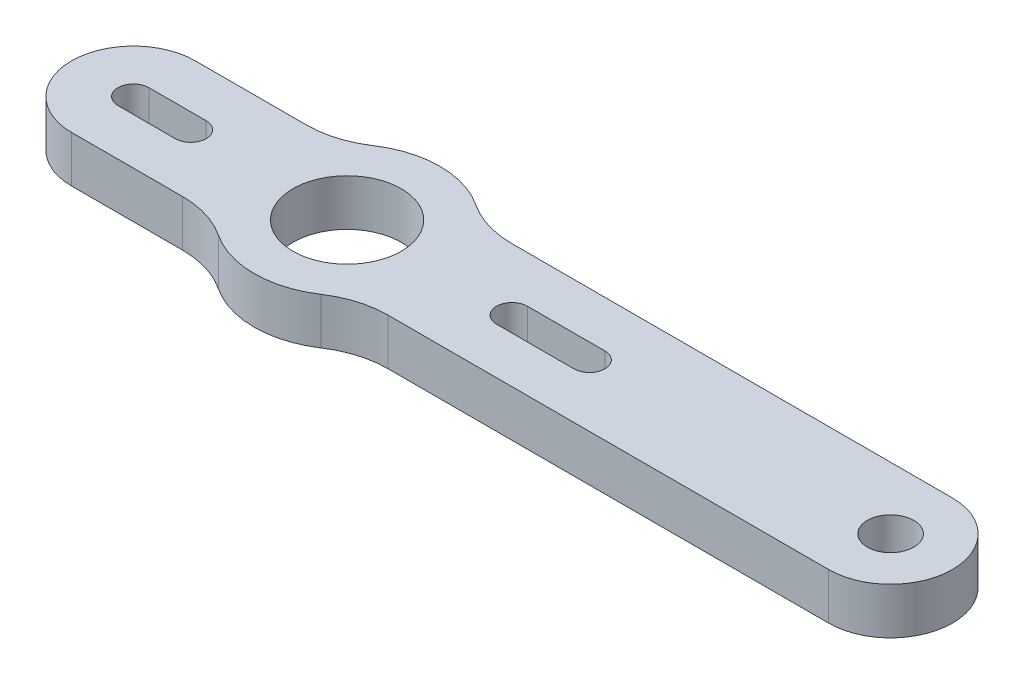
ISO-10303-21;
HEADER;
FILE_DESCRIPTION(('STEP AP214'),'2;1');
FILE_NAME('part.step','',(''),(''),'','','');
FILE_SCHEMA(('AUTOMOTIVE_DESIGN { 1 0 10303 214 1 1 1 1 }'));
ENDSEC;
DATA;
#1=APPLICATION_CONTEXT('core data for automotive mechanical design processes');
#2=APPLICATION_PROTOCOL_DEFINITION('international standard','automotive_design',2000,#1);
#3=PRODUCT_CONTEXT('',#1,'mechanical');
#4=PRODUCT('Part','Part','',(#3));
#5=PRODUCT_RELATED_PRODUCT_CATEGORY('part','',(#4));
#6=PRODUCT_DEFINITION_FORMATION('','',#4);
#7=PRODUCT_DEFINITION_CONTEXT('part definition',#1,'design');
#8=PRODUCT_DEFINITION('design','',#6,#7);
#9=PRODUCT_DEFINITION_SHAPE('','',#8);
#10=(LENGTH_UNIT() NAMED_UNIT(*) SI_UNIT(.MILLI.,.METRE.));
#11=(NAMED_UNIT(*) PLANE_ANGLE_UNIT() SI_UNIT($,.RADIAN.));
#12=(NAMED_UNIT(*) SI_UNIT($,.STERADIAN.) SOLID_ANGLE_UNIT());
#13=UNCERTAINTY_MEASURE_WITH_UNIT(LENGTH_MEASURE(1.E-05),#10,'distance_accuracy_value','');
#14=(GEOMETRIC_REPRESENTATION_CONTEXT(3) GLOBAL_UNCERTAINTY_ASSIGNED_CONTEXT((#13)) GLOBAL_UNIT_ASSIGNED_CONTEXT((#10,
#11,#12)) REPRESENTATION_CONTEXT('',''));
#15=CARTESIAN_POINT('',(0.,0.,0.));
#16=DIRECTION('',(0.,0.,1.));
#17=DIRECTION('',(1.,0.,0.));
#18=AXIS2_PLACEMENT_3D('',#15,#16,#17);
#19=CARTESIAN_POINT('',(29.45,3.,0.));
#20=DIRECTION('',(0.,-1.,0.));
#21=DIRECTION('',(0.,0.,-1.));
#22=AXIS2_PLACEMENT_3D('',#19,#20,#21);
#23=CYLINDRICAL_SURFACE('',#22,1.);
#24=CARTESIAN_POINT('',(29.45,0.,0.));
#25=DIRECTION('',(0.,1.,0.));
#26=DIRECTION('',(0.,0.,1.));
#27=AXIS2_PLACEMENT_3D('',#24,#25,#26);
#28=CIRCLE('',#27,1.);
#29=CARTESIAN_POINT('',(29.45,0.,1.));
#30=VERTEX_POINT('',#29);
#31=CARTESIAN_POINT('',(29.45,0.,-1.));
#32=VERTEX_POINT('',#31);
#33=EDGE_CURVE('E266',#30,#32,#28,.T.);
#34=ORIENTED_EDGE('',*,*,#33,.F.);
#35=DIRECTION('',(0.,-1.,0.));
#36=VECTOR('',#35,1.);
#37=CARTESIAN_POINT('',(29.45,3.,1.));
#38=LINE('',#37,#36);
#39=CARTESIAN_POINT('',(29.45,3.,1.));
#40=VERTEX_POINT('',#39);
#41=EDGE_CURVE('E284',#40,#30,#38,.T.);
#42=ORIENTED_EDGE('',*,*,#41,.F.);
#43=CARTESIAN_POINT('',(29.45,3.,0.));
#44=DIRECTION('',(0.,1.,0.));
#45=DIRECTION('',(0.,0.,1.));
#46=AXIS2_PLACEMENT_3D('',#43,#44,#45);
#47=CIRCLE('',#46,1.);
#48=CARTESIAN_POINT('',(29.45,3.,-1.));
#49=VERTEX_POINT('',#48);
#50=EDGE_CURVE('E223',#40,#49,#47,.T.);
#51=ORIENTED_EDGE('',*,*,#50,.T.);
#52=DIRECTION('',(0.,-1.,0.));
#53=VECTOR('',#52,1.);
#54=CARTESIAN_POINT('',(29.45,3.,-1.));
#55=LINE('',#54,#53);
#56=EDGE_CURVE('E277',#49,#32,#55,.T.);
#57=ORIENTED_EDGE('',*,*,#56,.T.);
#58=EDGE_LOOP('',(#34,#42,#51,#57));
#59=FACE_BOUND('',#58,.T.);
#60=ADVANCED_FACE('F36',(#59),#23,.F.);
#61=CARTESIAN_POINT('',(0.,3.,1.));
#62=DIRECTION('',(0.,0.,-1.));
#63=DIRECTION('',(-1.,0.,0.));
#64=AXIS2_PLACEMENT_3D('',#61,#62,#63);
#65=PLANE('',#64);
#66=DIRECTION('',(1.,0.,0.));
#67=VECTOR('',#66,1.);
#68=CARTESIAN_POINT('',(0.,0.,1.));
#69=LINE('',#68,#67);
#70=CARTESIAN_POINT('',(24.45,0.,1.));
#71=VERTEX_POINT('',#70);
#72=EDGE_CURVE('E269',#71,#30,#69,.T.);
#73=ORIENTED_EDGE('',*,*,#72,.F.);
#74=DIRECTION('',(0.,-1.,0.));
#75=VECTOR('',#74,1.);
#76=CARTESIAN_POINT('',(24.45,3.,1.));
#77=LINE('',#76,#75);
#78=CARTESIAN_POINT('',(24.45,3.,1.));
#79=VERTEX_POINT('',#78);
#80=EDGE_CURVE('E282',#79,#71,#77,.T.);
#81=ORIENTED_EDGE('',*,*,#80,.F.);
#82=DIRECTION('',(1.,0.,0.));
#83=VECTOR('',#82,1.);
#84=CARTESIAN_POINT('',(0.,3.,1.));
#85=LINE('',#84,#83);
#86=EDGE_CURVE('E226',#79,#40,#85,.T.);
#87=ORIENTED_EDGE('',*,*,#86,.T.);
#88=ORIENTED_EDGE('',*,*,#41,.T.);
#89=EDGE_LOOP('',(#73,#81,#87,#88));
#90=FACE_BOUND('',#89,.T.);
#91=ADVANCED_FACE('F390',(#90),#65,.T.);
#92=CARTESIAN_POINT('',(24.45,3.,0.));
#93=DIRECTION('',(0.,-1.,0.));
#94=DIRECTION('',(0.,0.,-1.));
#95=AXIS2_PLACEMENT_3D('',#92,#93,#94);
#96=CYLINDRICAL_SURFACE('',#95,1.);
#97=CARTESIAN_POINT('',(24.45,0.,0.));
#98=DIRECTION('',(0.,1.,0.));
#99=DIRECTION('',(0.,0.,1.));
#100=AXIS2_PLACEMENT_3D('',#97,#98,#99);
#101=CIRCLE('',#100,1.);
#102=CARTESIAN_POINT('',(24.45,0.,-1.));
#103=VERTEX_POINT('',#102);
#104=EDGE_CURVE('E272',#103,#71,#101,.T.);
#105=ORIENTED_EDGE('',*,*,#104,.F.);
#106=DIRECTION('',(0.,-1.,0.));
#107=VECTOR('',#106,1.);
#108=CARTESIAN_POINT('',(24.45,3.,-1.));
#109=LINE('',#108,#107);
#110=CARTESIAN_POINT('',(24.45,3.,-1.));
#111=VERTEX_POINT('',#110);
#112=EDGE_CURVE('E279',#111,#103,#109,.T.);
#113=ORIENTED_EDGE('',*,*,#112,.F.);
#114=CARTESIAN_POINT('',(24.45,3.,0.));
#115=DIRECTION('',(0.,1.,0.));
#116=DIRECTION('',(0.,0.,1.));
#117=AXIS2_PLACEMENT_3D('',#114,#115,#116);
#118=CIRCLE('',#117,1.);
#119=EDGE_CURVE('E229',#111,#79,#118,.T.);
#120=ORIENTED_EDGE('',*,*,#119,.T.);
#121=ORIENTED_EDGE('',*,*,#80,.T.);
#122=EDGE_LOOP('',(#105,#113,#120,#121));
#123=FACE_BOUND('',#122,.T.);
#124=ADVANCED_FACE('F383',(#123),#96,.F.);
#125=CARTESIAN_POINT('',(0.,3.,4.));
#126=DIRECTION('',(0.,0.,-1.));
#127=DIRECTION('',(-1.,0.,0.));
#128=AXIS2_PLACEMENT_3D('',#125,#126,#127);
#129=PLANE('',#128);
#130=DIRECTION('',(1.,0.,0.));
#131=VECTOR('',#130,1.);
#132=CARTESIAN_POINT('',(0.,0.,4.));
#133=LINE('',#132,#131);
#134=CARTESIAN_POINT('',(0.,0.,4.));
#135=VERTEX_POINT('',#134);
#136=CARTESIAN_POINT('',(7.1667504192892,0.,4.));
#137=VERTEX_POINT('',#136);
#138=EDGE_CURVE('E245',#135,#137,#133,.T.);
#139=ORIENTED_EDGE('',*,*,#138,.T.);
#140=DIRECTION('',(0.,1.,0.));
#141=VECTOR('',#140,1.);
#142=CARTESIAN_POINT('',(7.1667504192892,3.,4.));
#143=LINE('',#142,#141);
#144=CARTESIAN_POINT('',(7.1667504192892,3.,4.));
#145=VERTEX_POINT('',#144);
#146=EDGE_CURVE('E314',#137,#145,#143,.T.);
#147=ORIENTED_EDGE('',*,*,#146,.T.);
#148=DIRECTION('',(1.,0.,0.));
#149=VECTOR('',#148,1.);
#150=CARTESIAN_POINT('',(0.,3.,4.));
#151=LINE('',#150,#149);
#152=CARTESIAN_POINT('',(0.,3.,4.));
#153=VERTEX_POINT('',#152);
#154=EDGE_CURVE('E203',#153,#145,#151,.T.);
#155=ORIENTED_EDGE('',*,*,#154,.F.);
#156=DIRECTION('',(0.,-1.,0.));
#157=VECTOR('',#156,1.);
#158=CARTESIAN_POINT('',(0.,3.,4.));
#159=LINE('',#158,#157);
#160=EDGE_CURVE('E182',#153,#135,#159,.T.);
#161=ORIENTED_EDGE('',*,*,#160,.T.);
#162=EDGE_LOOP('',(#139,#147,#155,#161));
#163=FACE_BOUND('',#162,.T.);
#164=ADVANCED_FACE('F381',(#163),#129,.F.);
#165=CARTESIAN_POINT('',(13.8,3.,0.));
#166=DIRECTION('',(0.,-1.,0.));
#167=DIRECTION('',(0.,0.,-1.));
#168=AXIS2_PLACEMENT_3D('',#165,#166,#167);
#169=CYLINDRICAL_SURFACE('',#168,6.);
#170=CARTESIAN_POINT('',(13.8,3.,0.));
#171=DIRECTION('',(0.,1.,0.));
#172=DIRECTION('',(0.,0.,1.));
#173=AXIS2_PLACEMENT_3D('',#170,#171,#172);
#174=CIRCLE('',#173,6.);
#175=CARTESIAN_POINT('',(10.4833752096446,3.,5.));
#176=VERTEX_POINT('',#175);
#177=CARTESIAN_POINT('',(17.1166247903554,3.,5.));
#178=VERTEX_POINT('',#177);
#179=EDGE_CURVE('E206',#176,#178,#174,.T.);
#180=ORIENTED_EDGE('',*,*,#179,.F.);
#181=DIRECTION('',(0.,-1.,0.));
#182=VECTOR('',#181,1.);
#183=CARTESIAN_POINT('',(10.4833752096446,3.,5.));
#184=LINE('',#183,#182);
#185=CARTESIAN_POINT('',(10.4833752096446,0.,5.));
#186=VERTEX_POINT('',#185);
#187=EDGE_CURVE('E311',#176,#186,#184,.T.);
#188=ORIENTED_EDGE('',*,*,#187,.T.);
#189=CARTESIAN_POINT('',(13.8,0.,0.));
#190=DIRECTION('',(0.,1.,0.));
#191=DIRECTION('',(0.,0.,1.));
#192=AXIS2_PLACEMENT_3D('',#189,#190,#191);
#193=CIRCLE('',#192,6.);
#194=CARTESIAN_POINT('',(17.1166247903554,0.,5.));
#195=VERTEX_POINT('',#194);
#196=EDGE_CURVE('E248',#186,#195,#193,.T.);
#197=ORIENTED_EDGE('',*,*,#196,.T.);
#198=DIRECTION('',(0.,-1.,0.));
#199=VECTOR('',#198,1.);
#200=CARTESIAN_POINT('',(17.1166247903554,3.,5.));
#201=LINE('',#200,#199);
#202=EDGE_CURVE('E309',#195,#178,#201,.F.);
#203=ORIENTED_EDGE('',*,*,#202,.T.);
#204=EDGE_LOOP('',(#180,#188,#197,#203));
#205=FACE_BOUND('',#204,.T.);
#206=ADVANCED_FACE('F338',(#205),#169,.T.);
#207=CARTESIAN_POINT('',(0.,3.,4.));
#208=DIRECTION('',(0.,0.,-1.));
#209=DIRECTION('',(-1.,0.,0.));
#210=AXIS2_PLACEMENT_3D('',#207,#208,#209);
#211=PLANE('',#210);
#212=DIRECTION('',(1.,0.,0.));
#213=VECTOR('',#212,1.);
#214=CARTESIAN_POINT('',(0.,3.,4.));
#215=LINE('',#214,#213);
#216=CARTESIAN_POINT('',(20.4332495807108,3.,4.));
#217=VERTEX_POINT('',#216);
#218=CARTESIAN_POINT('',(48.9,3.,4.));
#219=VERTEX_POINT('',#218);
#220=EDGE_CURVE('E208',#217,#219,#215,.T.);
#221=ORIENTED_EDGE('',*,*,#220,.F.);
#222=DIRECTION('',(0.,1.,0.));
#223=VECTOR('',#222,1.);
#224=CARTESIAN_POINT('',(20.4332495807108,0.,4.));
#225=LINE('',#224,#223);
#226=CARTESIAN_POINT('',(20.4332495807108,0.,4.));
#227=VERTEX_POINT('',#226);
#228=EDGE_CURVE('E316',#217,#227,#225,.F.);
#229=ORIENTED_EDGE('',*,*,#228,.T.);
#230=DIRECTION('',(1.,0.,0.));
#231=VECTOR('',#230,1.);
#232=CARTESIAN_POINT('',(0.,0.,4.));
#233=LINE('',#232,#231);
#234=CARTESIAN_POINT('',(48.9,0.,4.));
#235=VERTEX_POINT('',#234);
#236=EDGE_CURVE('E251',#227,#235,#233,.T.);
#237=ORIENTED_EDGE('',*,*,#236,.T.);
#238=DIRECTION('',(0.,-1.,0.));
#239=VECTOR('',#238,1.);
#240=CARTESIAN_POINT('',(48.9,3.,4.));
#241=LINE('',#240,#239);
#242=EDGE_CURVE('E280',#219,#235,#241,.T.);
#243=ORIENTED_EDGE('',*,*,#242,.F.);
#244=EDGE_LOOP('',(#221,#229,#237,#243));
#245=FACE_BOUND('',#244,.T.);
#246=ADVANCED_FACE('F341',(#245),#211,.F.);
#247=CARTESIAN_POINT('',(48.9,3.,0.));
#248=DIRECTION('',(0.,-1.,0.));
#249=DIRECTION('',(0.,0.,-1.));
#250=AXIS2_PLACEMENT_3D('',#247,#248,#249);
#251=CYLINDRICAL_SURFACE('',#250,4.);
#252=CARTESIAN_POINT('',(48.9,0.,0.));
#253=DIRECTION('',(0.,1.,0.));
#254=DIRECTION('',(0.,0.,1.));
#255=AXIS2_PLACEMENT_3D('',#252,#253,#254);
#256=CIRCLE('',#255,4.);
#257=CARTESIAN_POINT('',(48.9,0.,-4.));
#258=VERTEX_POINT('',#257);
#259=EDGE_CURVE('E253',#235,#258,#256,.T.);
#260=ORIENTED_EDGE('',*,*,#259,.T.);
#261=DIRECTION('',(0.,-1.,0.));
#262=VECTOR('',#261,1.);
#263=CARTESIAN_POINT('',(48.9,3.,-4.));
#264=LINE('',#263,#262);
#265=CARTESIAN_POINT('',(48.9,3.,-4.));
#266=VERTEX_POINT('',#265);
#267=EDGE_CURVE('E291',#266,#258,#264,.T.);
#268=ORIENTED_EDGE('',*,*,#267,.F.);
#269=CARTESIAN_POINT('',(48.9,3.,0.));
#270=DIRECTION('',(0.,1.,0.));
#271=DIRECTION('',(0.,0.,1.));
#272=AXIS2_PLACEMENT_3D('',#269,#270,#271);
#273=CIRCLE('',#272,4.);
#274=EDGE_CURVE('E210',#219,#266,#273,.T.);
#275=ORIENTED_EDGE('',*,*,#274,.F.);
#276=ORIENTED_EDGE('',*,*,#242,.T.);
#277=EDGE_LOOP('',(#260,#268,#275,#276));
#278=FACE_BOUND('',#277,.T.);
#279=ADVANCED_FACE('F349',(#278),#251,.T.);
#280=CARTESIAN_POINT('',(0.,3.,-4.));
#281=DIRECTION('',(0.,0.,-1.));
#282=DIRECTION('',(-1.,0.,0.));
#283=AXIS2_PLACEMENT_3D('',#280,#281,#282);
#284=PLANE('',#283);
#285=DIRECTION('',(1.,0.,0.));
#286=VECTOR('',#285,1.);
#287=CARTESIAN_POINT('',(0.,0.,-4.));
#288=LINE('',#287,#286);
#289=CARTESIAN_POINT('',(20.4332495807108,0.,-4.));
#290=VERTEX_POINT('',#289);
#291=EDGE_CURVE('E256',#290,#258,#288,.T.);
#292=ORIENTED_EDGE('',*,*,#291,.F.);
#293=DIRECTION('',(0.,-1.,0.));
#294=VECTOR('',#293,1.);
#295=CARTESIAN_POINT('',(20.4332495807108,3.,-4.));
#296=LINE('',#295,#294);
#297=CARTESIAN_POINT('',(20.4332495807108,3.,-4.));
#298=VERTEX_POINT('',#297);
#299=EDGE_CURVE('E307',#290,#298,#296,.F.);
#300=ORIENTED_EDGE('',*,*,#299,.T.);
#301=DIRECTION('',(1.,0.,0.));
#302=VECTOR('',#301,1.);
#303=CARTESIAN_POINT('',(0.,3.,-4.));
#304=LINE('',#303,#302);
#305=EDGE_CURVE('E213',#298,#266,#304,.T.);
#306=ORIENTED_EDGE('',*,*,#305,.T.);
#307=ORIENTED_EDGE('',*,*,#267,.T.);
#308=EDGE_LOOP('',(#292,#300,#306,#307));
#309=FACE_BOUND('',#308,.T.);
#310=ADVANCED_FACE('F352',(#309),#284,.T.);
#311=CARTESIAN_POINT('',(13.8,3.,0.));
#312=DIRECTION('',(0.,-1.,0.));
#313=DIRECTION('',(0.,0.,-1.));
#314=AXIS2_PLACEMENT_3D('',#311,#312,#313);
#315=CYLINDRICAL_SURFACE('',#314,6.);
#316=CARTESIAN_POINT('',(13.8,0.,0.));
#317=DIRECTION('',(0.,1.,0.));
#318=DIRECTION('',(0.,0.,1.));
#319=AXIS2_PLACEMENT_3D('',#316,#317,#318);
#320=CIRCLE('',#319,6.);
#321=CARTESIAN_POINT('',(17.1166247903554,0.,-5.));
#322=VERTEX_POINT('',#321);
#323=CARTESIAN_POINT('',(10.4833752096446,0.,-5.));
#324=VERTEX_POINT('',#323);
#325=EDGE_CURVE('E258',#322,#324,#320,.T.);
#326=ORIENTED_EDGE('',*,*,#325,.T.);
#327=DIRECTION('',(0.,-1.,0.));
#328=VECTOR('',#327,1.);
#329=CARTESIAN_POINT('',(10.4833752096446,3.,-5.));
#330=LINE('',#329,#328);
#331=CARTESIAN_POINT('',(10.4833752096446,3.,-5.));
#332=VERTEX_POINT('',#331);
#333=EDGE_CURVE('E305',#324,#332,#330,.F.);
#334=ORIENTED_EDGE('',*,*,#333,.T.);
#335=CARTESIAN_POINT('',(13.8,3.,0.));
#336=DIRECTION('',(0.,1.,0.));
#337=DIRECTION('',(0.,0.,1.));
#338=AXIS2_PLACEMENT_3D('',#335,#336,#337);
#339=CIRCLE('',#338,6.);
#340=CARTESIAN_POINT('',(17.1166247903554,3.,-5.));
#341=VERTEX_POINT('',#340);
#342=EDGE_CURVE('E215',#341,#332,#339,.T.);
#343=ORIENTED_EDGE('',*,*,#342,.F.);
#344=DIRECTION('',(0.,-1.,0.));
#345=VECTOR('',#344,1.);
#346=CARTESIAN_POINT('',(17.1166247903554,3.,-5.));
#347=LINE('',#346,#345);
#348=EDGE_CURVE('E302',#341,#322,#347,.T.);
#349=ORIENTED_EDGE('',*,*,#348,.T.);
#350=EDGE_LOOP('',(#326,#334,#343,#349));
#351=FACE_BOUND('',#350,.T.);
#352=ADVANCED_FACE('F360',(#351),#315,.T.);
#353=CARTESIAN_POINT('',(0.,3.,-4.));
#354=DIRECTION('',(0.,0.,-1.));
#355=DIRECTION('',(-1.,0.,0.));
#356=AXIS2_PLACEMENT_3D('',#353,#354,#355);
#357=PLANE('',#356);
#358=DIRECTION('',(1.,0.,0.));
#359=VECTOR('',#358,1.);
#360=CARTESIAN_POINT('',(0.,3.,-4.));
#361=LINE('',#360,#359);
#362=CARTESIAN_POINT('',(0.,3.,-4.));
#363=VERTEX_POINT('',#362);
#364=CARTESIAN_POINT('',(7.1667504192892,3.,-4.));
#365=VERTEX_POINT('',#364);
#366=EDGE_CURVE('E218',#363,#365,#361,.T.);
#367=ORIENTED_EDGE('',*,*,#366,.T.);
#368=DIRECTION('',(0.,-1.,0.));
#369=VECTOR('',#368,1.);
#370=CARTESIAN_POINT('',(7.1667504192892,3.,-4.));
#371=LINE('',#370,#369);
#372=CARTESIAN_POINT('',(7.1667504192892,0.,-4.));
#373=VERTEX_POINT('',#372);
#374=EDGE_CURVE('E286',#365,#373,#371,.T.);
#375=ORIENTED_EDGE('',*,*,#374,.T.);
#376=DIRECTION('',(1.,0.,0.));
#377=VECTOR('',#376,1.);
#378=CARTESIAN_POINT('',(0.,0.,-4.));
#379=LINE('',#378,#377);
#380=CARTESIAN_POINT('',(0.,0.,-4.));
#381=VERTEX_POINT('',#380);
#382=EDGE_CURVE('E261',#381,#373,#379,.T.);
#383=ORIENTED_EDGE('',*,*,#382,.F.);
#384=DIRECTION('',(0.,-1.,0.));
#385=VECTOR('',#384,1.);
#386=CARTESIAN_POINT('',(0.,3.,-4.));
#387=LINE('',#386,#385);
#388=EDGE_CURVE('E289',#363,#381,#387,.T.);
#389=ORIENTED_EDGE('',*,*,#388,.F.);
#390=EDGE_LOOP('',(#367,#375,#383,#389));
#391=FACE_BOUND('',#390,.T.);
#392=ADVANCED_FACE('F368',(#391),#357,.T.);
#393=CARTESIAN_POINT('',(3.7,3.,0.));
#394=DIRECTION('',(0.,-1.,0.));
#395=DIRECTION('',(0.,0.,-1.));
#396=AXIS2_PLACEMENT_3D('',#393,#394,#395);
#397=CYLINDRICAL_SURFACE('',#396,1.);
#398=CARTESIAN_POINT('',(3.7,0.,0.));
#399=DIRECTION('',(0.,1.,0.));
#400=DIRECTION('',(0.,0.,1.));
#401=AXIS2_PLACEMENT_3D('',#398,#399,#400);
#402=CIRCLE('',#401,1.);
#403=CARTESIAN_POINT('',(3.7,0.,1.));
#404=VERTEX_POINT('',#403);
#405=CARTESIAN_POINT('',(3.7,0.,-1.));
#406=VERTEX_POINT('',#405);
#407=EDGE_CURVE('E177',#404,#406,#402,.T.);
#408=ORIENTED_EDGE('',*,*,#407,.F.);
#409=DIRECTION('',(0.,-1.,0.));
#410=VECTOR('',#409,1.);
#411=CARTESIAN_POINT('',(3.7,3.,1.));
#412=LINE('',#411,#410);
#413=CARTESIAN_POINT('',(3.7,3.,1.));
#414=VERTEX_POINT('',#413);
#415=EDGE_CURVE('E172',#414,#404,#412,.T.);
#416=ORIENTED_EDGE('',*,*,#415,.F.);
#417=CARTESIAN_POINT('',(3.7,3.,0.));
#418=DIRECTION('',(0.,1.,0.));
#419=DIRECTION('',(0.,0.,1.));
#420=AXIS2_PLACEMENT_3D('',#417,#418,#419);
#421=CIRCLE('',#420,1.);
#422=CARTESIAN_POINT('',(3.7,3.,-1.));
#423=VERTEX_POINT('',#422);
#424=EDGE_CURVE('E175',#414,#423,#421,.T.);
#425=ORIENTED_EDGE('',*,*,#424,.T.);
#426=DIRECTION('',(0.,-1.,0.));
#427=VECTOR('',#426,1.);
#428=CARTESIAN_POINT('',(3.7,3.,-1.));
#429=LINE('',#428,#427);
#430=EDGE_CURVE('E234',#423,#406,#429,.T.);
#431=ORIENTED_EDGE('',*,*,#430,.T.);
#432=EDGE_LOOP('',(#408,#416,#425,#431));
#433=FACE_BOUND('',#432,.T.);
#434=ADVANCED_FACE('F174',(#433),#397,.F.);
#435=CARTESIAN_POINT('',(0.,3.,1.));
#436=DIRECTION('',(0.,0.,-1.));
#437=DIRECTION('',(-1.,0.,0.));
#438=AXIS2_PLACEMENT_3D('',#435,#436,#437);
#439=PLANE('',#438);
#440=DIRECTION('',(1.,0.,0.));
#441=VECTOR('',#440,1.);
#442=CARTESIAN_POINT('',(0.,0.,1.));
#443=LINE('',#442,#441);
#444=CARTESIAN_POINT('',(0.,0.,1.));
#445=VERTEX_POINT('',#444);
#446=EDGE_CURVE('E236',#445,#404,#443,.T.);
#447=ORIENTED_EDGE('',*,*,#446,.F.);
#448=DIRECTION('',(0.,-1.,0.));
#449=VECTOR('',#448,1.);
#450=CARTESIAN_POINT('',(0.,3.,1.));
#451=LINE('',#450,#449);
#452=CARTESIAN_POINT('',(0.,3.,1.));
#453=VERTEX_POINT('',#452);
#454=EDGE_CURVE('E183',#453,#445,#451,.T.);
#455=ORIENTED_EDGE('',*,*,#454,.F.);
#456=DIRECTION('',(1.,0.,0.));
#457=VECTOR('',#456,1.);
#458=CARTESIAN_POINT('',(0.,3.,1.));
#459=LINE('',#458,#457);
#460=EDGE_CURVE('E189',#453,#414,#459,.T.);
#461=ORIENTED_EDGE('',*,*,#460,.T.);
#462=ORIENTED_EDGE('',*,*,#415,.T.);
#463=EDGE_LOOP('',(#447,#455,#461,#462));
#464=FACE_BOUND('',#463,.T.);
#465=ADVANCED_FACE('F196',(#464),#439,.T.);
#466=CARTESIAN_POINT('',(0.,3.,0.));
#467=DIRECTION('',(0.,-1.,0.));
#468=DIRECTION('',(0.,0.,-1.));
#469=AXIS2_PLACEMENT_3D('',#466,#467,#468);
#470=CYLINDRICAL_SURFACE('',#469,1.);
#471=CARTESIAN_POINT('',(0.,0.,0.));
#472=DIRECTION('',(0.,1.,0.));
#473=DIRECTION('',(0.,0.,1.));
#474=AXIS2_PLACEMENT_3D('',#471,#472,#473);
#475=CIRCLE('',#474,1.);
#476=CARTESIAN_POINT('',(0.,0.,-1.));
#477=VERTEX_POINT('',#476);
#478=EDGE_CURVE('E239',#477,#445,#475,.T.);
#479=ORIENTED_EDGE('',*,*,#478,.F.);
#480=DIRECTION('',(0.,-1.,0.));
#481=VECTOR('',#480,1.);
#482=CARTESIAN_POINT('',(0.,3.,-1.));
#483=LINE('',#482,#481);
#484=CARTESIAN_POINT('',(0.,3.,-1.));
#485=VERTEX_POINT('',#484);
#486=EDGE_CURVE('E297',#485,#477,#483,.T.);
#487=ORIENTED_EDGE('',*,*,#486,.F.);
#488=CARTESIAN_POINT('',(0.,3.,0.));
#489=DIRECTION('',(0.,1.,0.));
#490=DIRECTION('',(0.,0.,1.));
#491=AXIS2_PLACEMENT_3D('',#488,#489,#490);
#492=CIRCLE('',#491,1.);
#493=EDGE_CURVE('E197',#485,#453,#492,.T.);
#494=ORIENTED_EDGE('',*,*,#493,.T.);
#495=ORIENTED_EDGE('',*,*,#454,.T.);
#496=EDGE_LOOP('',(#479,#487,#494,#495));
#497=FACE_BOUND('',#496,.T.);
#498=ADVANCED_FACE('F407',(#497),#470,.F.);
#499=CARTESIAN_POINT('',(0.,3.,0.));
#500=DIRECTION('',(0.,-1.,0.));
#501=DIRECTION('',(0.,0.,-1.));
#502=AXIS2_PLACEMENT_3D('',#499,#500,#501);
#503=CYLINDRICAL_SURFACE('',#502,4.);
#504=CARTESIAN_POINT('',(0.,0.,0.));
#505=DIRECTION('',(0.,1.,0.));
#506=DIRECTION('',(0.,0.,1.));
#507=AXIS2_PLACEMENT_3D('',#504,#505,#506);
#508=CIRCLE('',#507,4.);
#509=EDGE_CURVE('E264',#381,#135,#508,.T.);
#510=ORIENTED_EDGE('',*,*,#509,.T.);
#511=ORIENTED_EDGE('',*,*,#160,.F.);
#512=CARTESIAN_POINT('',(0.,3.,0.));
#513=DIRECTION('',(0.,1.,0.));
#514=DIRECTION('',(0.,0.,1.));
#515=AXIS2_PLACEMENT_3D('',#512,#513,#514);
#516=CIRCLE('',#515,4.);
#517=EDGE_CURVE('E221',#363,#153,#516,.T.);
#518=ORIENTED_EDGE('',*,*,#517,.F.);
#519=ORIENTED_EDGE('',*,*,#388,.T.);
#520=EDGE_LOOP('',(#510,#511,#518,#519));
#521=FACE_BOUND('',#520,.T.);
#522=ADVANCED_FACE('F374',(#521),#503,.T.);
#523=CARTESIAN_POINT('',(0.,3.,-1.));
#524=DIRECTION('',(0.,0.,-1.));
#525=DIRECTION('',(-1.,0.,0.));
#526=AXIS2_PLACEMENT_3D('',#523,#524,#525);
#527=PLANE('',#526);
#528=DIRECTION('',(1.,0.,0.));
#529=VECTOR('',#528,1.);
#530=CARTESIAN_POINT('',(0.,0.,-1.));
#531=LINE('',#530,#529);
#532=EDGE_CURVE('E242',#477,#406,#531,.T.);
#533=ORIENTED_EDGE('',*,*,#532,.T.);
#534=ORIENTED_EDGE('',*,*,#430,.F.);
#535=DIRECTION('',(1.,0.,0.));
#536=VECTOR('',#535,1.);
#537=CARTESIAN_POINT('',(0.,3.,-1.));
#538=LINE('',#537,#536);
#539=EDGE_CURVE('E192',#485,#423,#538,.T.);
#540=ORIENTED_EDGE('',*,*,#539,.F.);
#541=ORIENTED_EDGE('',*,*,#486,.T.);
#542=EDGE_LOOP('',(#533,#534,#540,#541));
#543=FACE_BOUND('',#542,.T.);
#544=ADVANCED_FACE('F406',(#543),#527,.F.);
#545=CARTESIAN_POINT('',(0.,3.,-1.));
#546=DIRECTION('',(0.,0.,-1.));
#547=DIRECTION('',(-1.,0.,0.));
#548=AXIS2_PLACEMENT_3D('',#545,#546,#547);
#549=PLANE('',#548);
#550=DIRECTION('',(1.,0.,0.));
#551=VECTOR('',#550,1.);
#552=CARTESIAN_POINT('',(0.,0.,-1.));
#553=LINE('',#552,#551);
#554=EDGE_CURVE('E194',#103,#32,#553,.T.);
#555=ORIENTED_EDGE('',*,*,#554,.T.);
#556=ORIENTED_EDGE('',*,*,#56,.F.);
#557=DIRECTION('',(1.,0.,0.));
#558=VECTOR('',#557,1.);
#559=CARTESIAN_POINT('',(0.,3.,-1.));
#560=LINE('',#559,#558);
#561=EDGE_CURVE('E232',#111,#49,#560,.T.);
#562=ORIENTED_EDGE('',*,*,#561,.F.);
#563=ORIENTED_EDGE('',*,*,#112,.T.);
#564=EDGE_LOOP('',(#555,#556,#562,#563));
#565=FACE_BOUND('',#564,.T.);
#566=ADVANCED_FACE('F468',(#565),#549,.F.);
#567=CARTESIAN_POINT('',(0.,3.,0.));
#568=DIRECTION('',(0.,1.,0.));
#569=DIRECTION('',(0.,0.,1.));
#570=AXIS2_PLACEMENT_3D('',#567,#568,#569);
#571=PLANE('',#570);
#572=CARTESIAN_POINT('',(13.8,3.,0.));
#573=DIRECTION('',(0.,1.,0.));
#574=DIRECTION('',(0.,0.,1.));
#575=AXIS2_PLACEMENT_3D('',#572,#573,#574);
#576=CIRCLE('',#575,3.5);
#577=CARTESIAN_POINT('',(13.8,3.,3.5));
#578=VERTEX_POINT('',#577);
#579=EDGE_CURVE('E614',#578,#578,#576,.T.);
#580=ORIENTED_EDGE('',*,*,#579,.F.);
#581=EDGE_LOOP('',(#580));
#582=FACE_BOUND('',#581,.T.);
#583=CARTESIAN_POINT('',(48.9,3.,0.));
#584=DIRECTION('',(0.,1.,0.));
#585=DIRECTION('',(0.,0.,1.));
#586=AXIS2_PLACEMENT_3D('',#583,#584,#585);
#587=CIRCLE('',#586,1.5);
#588=CARTESIAN_POINT('',(48.9,3.,1.5));
#589=VERTEX_POINT('',#588);
#590=EDGE_CURVE('E616',#589,#589,#587,.T.);
#591=ORIENTED_EDGE('',*,*,#590,.F.);
#592=EDGE_LOOP('',(#591));
#593=FACE_BOUND('',#592,.T.);
#594=ORIENTED_EDGE('',*,*,#424,.F.);
#595=ORIENTED_EDGE('',*,*,#460,.F.);
#596=ORIENTED_EDGE('',*,*,#493,.F.);
#597=ORIENTED_EDGE('',*,*,#539,.T.);
#598=EDGE_LOOP('',(#594,#595,#596,#597));
#599=FACE_BOUND('',#598,.T.);
#600=ORIENTED_EDGE('',*,*,#154,.T.);
#601=CARTESIAN_POINT('',(7.1667504192892,3.,10.));
#602=DIRECTION('',(0.,1.,0.));
#603=DIRECTION('',(0.,0.,1.));
#604=AXIS2_PLACEMENT_3D('',#601,#602,#603);
#605=CIRCLE('',#604,6.);
#606=EDGE_CURVE('E328',#145,#176,#605,.F.);
#607=ORIENTED_EDGE('',*,*,#606,.T.);
#608=ORIENTED_EDGE('',*,*,#179,.T.);
#609=CARTESIAN_POINT('',(20.4332495807108,3.,10.));
#610=DIRECTION('',(0.,1.,0.));
#611=DIRECTION('',(0.,0.,1.));
#612=AXIS2_PLACEMENT_3D('',#609,#610,#611);
#613=CIRCLE('',#612,6.);
#614=EDGE_CURVE('E11',#178,#217,#613,.F.);
#615=ORIENTED_EDGE('',*,*,#614,.T.);
#616=ORIENTED_EDGE('',*,*,#220,.T.);
#617=ORIENTED_EDGE('',*,*,#274,.T.);
#618=ORIENTED_EDGE('',*,*,#305,.F.);
#619=CARTESIAN_POINT('',(20.4332495807108,3.,-10.));
#620=DIRECTION('',(0.,1.,0.));
#621=DIRECTION('',(0.,0.,1.));
#622=AXIS2_PLACEMENT_3D('',#619,#620,#621);
#623=CIRCLE('',#622,6.);
#624=EDGE_CURVE('E324',#298,#341,#623,.F.);
#625=ORIENTED_EDGE('',*,*,#624,.T.);
#626=ORIENTED_EDGE('',*,*,#342,.T.);
#627=CARTESIAN_POINT('',(7.1667504192892,3.,-10.));
#628=DIRECTION('',(0.,1.,0.));
#629=DIRECTION('',(0.,0.,1.));
#630=AXIS2_PLACEMENT_3D('',#627,#628,#629);
#631=CIRCLE('',#630,6.);
#632=EDGE_CURVE('E320',#332,#365,#631,.F.);
#633=ORIENTED_EDGE('',*,*,#632,.T.);
#634=ORIENTED_EDGE('',*,*,#366,.F.);
#635=ORIENTED_EDGE('',*,*,#517,.T.);
#636=EDGE_LOOP('',(#600,#607,#608,#615,#616,#617,#618,#625,#626,#633,#634,#635));
#637=FACE_BOUND('',#636,.T.);
#638=ORIENTED_EDGE('',*,*,#50,.F.);
#639=ORIENTED_EDGE('',*,*,#86,.F.);
#640=ORIENTED_EDGE('',*,*,#119,.F.);
#641=ORIENTED_EDGE('',*,*,#561,.T.);
#642=EDGE_LOOP('',(#638,#639,#640,#641));
#643=FACE_BOUND('',#642,.T.);
#644=ADVANCED_FACE('F187',(#582,#593,#599,#637,#643),#571,.T.);
#645=CARTESIAN_POINT('',(0.,0.,0.));
#646=DIRECTION('',(0.,1.,0.));
#647=DIRECTION('',(0.,0.,1.));
#648=AXIS2_PLACEMENT_3D('',#645,#646,#647);
#649=PLANE('',#648);
#650=CARTESIAN_POINT('',(13.8,0.,0.));
#651=DIRECTION('',(0.,1.,0.));
#652=DIRECTION('',(0.,0.,1.));
#653=AXIS2_PLACEMENT_3D('',#650,#651,#652);
#654=CIRCLE('',#653,3.5);
#655=CARTESIAN_POINT('',(13.8,0.,3.5));
#656=VERTEX_POINT('',#655);
#657=EDGE_CURVE('E611',#656,#656,#654,.T.);
#658=ORIENTED_EDGE('',*,*,#657,.T.);
#659=EDGE_LOOP('',(#658));
#660=FACE_BOUND('',#659,.T.);
#661=CARTESIAN_POINT('',(48.9,0.,0.));
#662=DIRECTION('',(0.,1.,0.));
#663=DIRECTION('',(0.,0.,1.));
#664=AXIS2_PLACEMENT_3D('',#661,#662,#663);
#665=CIRCLE('',#664,1.5);
#666=CARTESIAN_POINT('',(48.9,0.,1.5));
#667=VERTEX_POINT('',#666);
#668=EDGE_CURVE('E237',#667,#667,#665,.T.);
#669=ORIENTED_EDGE('',*,*,#668,.T.);
#670=EDGE_LOOP('',(#669));
#671=FACE_BOUND('',#670,.T.);
#672=ORIENTED_EDGE('',*,*,#407,.T.);
#673=ORIENTED_EDGE('',*,*,#532,.F.);
#674=ORIENTED_EDGE('',*,*,#478,.T.);
#675=ORIENTED_EDGE('',*,*,#446,.T.);
#676=EDGE_LOOP('',(#672,#673,#674,#675));
#677=FACE_BOUND('',#676,.T.);
#678=ORIENTED_EDGE('',*,*,#138,.F.);
#679=ORIENTED_EDGE('',*,*,#509,.F.);
#680=ORIENTED_EDGE('',*,*,#382,.T.);
#681=CARTESIAN_POINT('',(7.1667504192892,0.,-10.));
#682=DIRECTION('',(0.,1.,0.));
#683=DIRECTION('',(0.,0.,1.));
#684=AXIS2_PLACEMENT_3D('',#681,#682,#683);
#685=CIRCLE('',#684,6.);
#686=EDGE_CURVE('E318',#373,#324,#685,.T.);
#687=ORIENTED_EDGE('',*,*,#686,.T.);
#688=ORIENTED_EDGE('',*,*,#325,.F.);
#689=CARTESIAN_POINT('',(20.4332495807108,0.,-10.));
#690=DIRECTION('',(0.,1.,0.));
#691=DIRECTION('',(0.,0.,1.));
#692=AXIS2_PLACEMENT_3D('',#689,#690,#691);
#693=CIRCLE('',#692,6.);
#694=EDGE_CURVE('E322',#322,#290,#693,.T.);
#695=ORIENTED_EDGE('',*,*,#694,.T.);
#696=ORIENTED_EDGE('',*,*,#291,.T.);
#697=ORIENTED_EDGE('',*,*,#259,.F.);
#698=ORIENTED_EDGE('',*,*,#236,.F.);
#699=CARTESIAN_POINT('',(20.4332495807108,0.,10.));
#700=DIRECTION('',(0.,1.,0.));
#701=DIRECTION('',(0.,0.,1.));
#702=AXIS2_PLACEMENT_3D('',#699,#700,#701);
#703=CIRCLE('',#702,6.);
#704=EDGE_CURVE('E44',#227,#195,#703,.T.);
#705=ORIENTED_EDGE('',*,*,#704,.T.);
#706=ORIENTED_EDGE('',*,*,#196,.F.);
#707=CARTESIAN_POINT('',(7.1667504192892,0.,10.));
#708=DIRECTION('',(0.,1.,0.));
#709=DIRECTION('',(0.,0.,1.));
#710=AXIS2_PLACEMENT_3D('',#707,#708,#709);
#711=CIRCLE('',#710,6.);
#712=EDGE_CURVE('E326',#186,#137,#711,.T.);
#713=ORIENTED_EDGE('',*,*,#712,.T.);
#714=EDGE_LOOP('',(#678,#679,#680,#687,#688,#695,#696,#697,#698,#705,#706,#713));
#715=FACE_BOUND('',#714,.T.);
#716=ORIENTED_EDGE('',*,*,#33,.T.);
#717=ORIENTED_EDGE('',*,*,#554,.F.);
#718=ORIENTED_EDGE('',*,*,#104,.T.);
#719=ORIENTED_EDGE('',*,*,#72,.T.);
#720=EDGE_LOOP('',(#716,#717,#718,#719));
#721=FACE_BOUND('',#720,.T.);
#722=ADVANCED_FACE('F333',(#660,#671,#677,#715,#721),#649,.F.);
#723=CARTESIAN_POINT('',(48.9,3.,0.));
#724=DIRECTION('',(0.,1.,0.));
#725=DIRECTION('',(0.,0.,1.));
#726=AXIS2_PLACEMENT_3D('',#723,#724,#725);
#727=CYLINDRICAL_SURFACE('',#726,1.5);
#728=ORIENTED_EDGE('',*,*,#668,.F.);
#729=EDGE_LOOP('',(#728));
#730=FACE_BOUND('',#729,.T.);
#731=ORIENTED_EDGE('',*,*,#590,.T.);
#732=EDGE_LOOP('',(#731));
#733=FACE_BOUND('',#732,.T.);
#734=ADVANCED_FACE('F489',(#730,#733),#727,.F.);
#735=CARTESIAN_POINT('',(13.8,3.,0.));
#736=DIRECTION('',(0.,1.,0.));
#737=DIRECTION('',(0.,0.,1.));
#738=AXIS2_PLACEMENT_3D('',#735,#736,#737);
#739=CYLINDRICAL_SURFACE('',#738,3.5);
#740=ORIENTED_EDGE('',*,*,#657,.F.);
#741=EDGE_LOOP('',(#740));
#742=FACE_BOUND('',#741,.T.);
#743=ORIENTED_EDGE('',*,*,#579,.T.);
#744=EDGE_LOOP('',(#743));
#745=FACE_BOUND('',#744,.T.);
#746=ADVANCED_FACE('F497',(#742,#745),#739,.F.);
#747=CARTESIAN_POINT('',(7.1667504192892,3.,-10.));
#748=DIRECTION('',(0.,-1.,0.));
#749=DIRECTION('',(0.,0.,-1.));
#750=AXIS2_PLACEMENT_3D('',#747,#748,#749);
#751=CYLINDRICAL_SURFACE('',#750,6.);
#752=ORIENTED_EDGE('',*,*,#632,.F.);
#753=ORIENTED_EDGE('',*,*,#333,.F.);
#754=ORIENTED_EDGE('',*,*,#686,.F.);
#755=ORIENTED_EDGE('',*,*,#374,.F.);
#756=EDGE_LOOP('',(#752,#753,#754,#755));
#757=FACE_BOUND('',#756,.T.);
#758=ADVANCED_FACE('F364',(#757),#751,.F.);
#759=CARTESIAN_POINT('',(20.4332495807108,3.,-10.));
#760=DIRECTION('',(0.,-1.,0.));
#761=DIRECTION('',(0.,0.,-1.));
#762=AXIS2_PLACEMENT_3D('',#759,#760,#761);
#763=CYLINDRICAL_SURFACE('',#762,6.);
#764=ORIENTED_EDGE('',*,*,#624,.F.);
#765=ORIENTED_EDGE('',*,*,#299,.F.);
#766=ORIENTED_EDGE('',*,*,#694,.F.);
#767=ORIENTED_EDGE('',*,*,#348,.F.);
#768=EDGE_LOOP('',(#764,#765,#766,#767));
#769=FACE_BOUND('',#768,.T.);
#770=ADVANCED_FACE('F355',(#769),#763,.F.);
#771=CARTESIAN_POINT('',(7.1667504192892,3.,10.));
#772=DIRECTION('',(0.,-1.,0.));
#773=DIRECTION('',(0.,0.,-1.));
#774=AXIS2_PLACEMENT_3D('',#771,#772,#773);
#775=CYLINDRICAL_SURFACE('',#774,6.);
#776=ORIENTED_EDGE('',*,*,#606,.F.);
#777=ORIENTED_EDGE('',*,*,#146,.F.);
#778=ORIENTED_EDGE('',*,*,#712,.F.);
#779=ORIENTED_EDGE('',*,*,#187,.F.);
#780=EDGE_LOOP('',(#776,#777,#778,#779));
#781=FACE_BOUND('',#780,.T.);
#782=ADVANCED_FACE('F380',(#781),#775,.F.);
#783=CARTESIAN_POINT('',(20.4332495807108,3.,10.));
#784=DIRECTION('',(0.,-1.,0.));
#785=DIRECTION('',(0.,0.,-1.));
#786=AXIS2_PLACEMENT_3D('',#783,#784,#785);
#787=CYLINDRICAL_SURFACE('',#786,6.);
#788=ORIENTED_EDGE('',*,*,#614,.F.);
#789=ORIENTED_EDGE('',*,*,#202,.F.);
#790=ORIENTED_EDGE('',*,*,#704,.F.);
#791=ORIENTED_EDGE('',*,*,#228,.F.);
#792=EDGE_LOOP('',(#788,#789,#790,#791));
#793=FACE_BOUND('',#792,.T.);
#794=ADVANCED_FACE('F38',(#793),#787,.F.);
#795=CLOSED_SHELL('',(#60,#91,#124,#164,#206,#246,#279,#310,#352,#392,#434,#465,#498,#522,#544,
#566,#644,#722,#734,#746,#758,#770,#782,#794));
#796=MANIFOLD_SOLID_BREP('B2',#795);
#797=ADVANCED_BREP_SHAPE_REPRESENTATION('',(#18,#796),#14);
#798=SHAPE_DEFINITION_REPRESENTATION(#9,#797);
ENDSEC;
END-ISO-10303-21;
